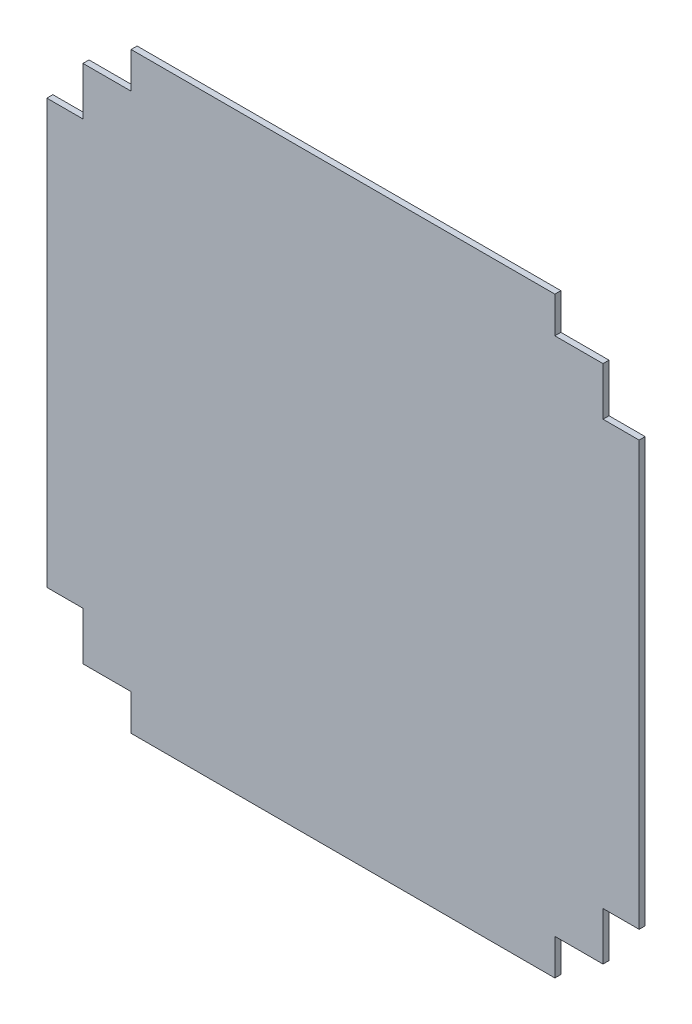
ISO-10303-21;
HEADER;
FILE_DESCRIPTION(('STEP AP214'),'2;1');
FILE_NAME('part.step','',(''),(''),'','','');
FILE_SCHEMA(('AUTOMOTIVE_DESIGN { 1 0 10303 214 1 1 1 1 }'));
ENDSEC;
DATA;
#1=APPLICATION_CONTEXT('core data for automotive mechanical design processes');
#2=APPLICATION_PROTOCOL_DEFINITION('international standard','automotive_design',2000,#1);
#3=PRODUCT_CONTEXT('',#1,'mechanical');
#4=PRODUCT('Part','Part','',(#3));
#5=PRODUCT_RELATED_PRODUCT_CATEGORY('part','',(#4));
#6=PRODUCT_DEFINITION_FORMATION('','',#4);
#7=PRODUCT_DEFINITION_CONTEXT('part definition',#1,'design');
#8=PRODUCT_DEFINITION('design','',#6,#7);
#9=PRODUCT_DEFINITION_SHAPE('','',#8);
#10=(LENGTH_UNIT() NAMED_UNIT(*) SI_UNIT(.MILLI.,.METRE.));
#11=(NAMED_UNIT(*) PLANE_ANGLE_UNIT() SI_UNIT($,.RADIAN.));
#12=(NAMED_UNIT(*) SI_UNIT($,.STERADIAN.) SOLID_ANGLE_UNIT());
#13=UNCERTAINTY_MEASURE_WITH_UNIT(LENGTH_MEASURE(1.E-05),#10,'distance_accuracy_value','');
#14=(GEOMETRIC_REPRESENTATION_CONTEXT(3) GLOBAL_UNCERTAINTY_ASSIGNED_CONTEXT((#13)) GLOBAL_UNIT_ASSIGNED_CONTEXT((#10,
#11,#12)) REPRESENTATION_CONTEXT('',''));
#15=CARTESIAN_POINT('',(0.,0.,0.));
#16=DIRECTION('',(0.,0.,1.));
#17=DIRECTION('',(1.,0.,0.));
#18=AXIS2_PLACEMENT_3D('',#15,#16,#17);
#19=CARTESIAN_POINT('',(0.,246.,5.));
#20=DIRECTION('',(0.,1.,0.));
#21=DIRECTION('',(0.,0.,1.));
#22=AXIS2_PLACEMENT_3D('',#19,#20,#21);
#23=PLANE('',#22);
#24=DIRECTION('',(1.,0.,0.));
#25=VECTOR('',#24,1.);
#26=CARTESIAN_POINT('',(0.,246.,0.));
#27=LINE('',#26,#25);
#28=CARTESIAN_POINT('',(-176.,246.,0.));
#29=VERTEX_POINT('',#28);
#30=CARTESIAN_POINT('',(176.,246.,0.));
#31=VERTEX_POINT('',#30);
#32=EDGE_CURVE('E209',#29,#31,#27,.T.);
#33=ORIENTED_EDGE('',*,*,#32,.F.);
#34=DIRECTION('',(0.,0.,-1.));
#35=VECTOR('',#34,1.);
#36=CARTESIAN_POINT('',(-176.,246.,5.));
#37=LINE('',#36,#35);
#38=CARTESIAN_POINT('',(-176.,246.,5.));
#39=VERTEX_POINT('',#38);
#40=EDGE_CURVE('E11',#39,#29,#37,.T.);
#41=ORIENTED_EDGE('',*,*,#40,.F.);
#42=DIRECTION('',(1.,0.,0.));
#43=VECTOR('',#42,1.);
#44=CARTESIAN_POINT('',(0.,246.,5.));
#45=LINE('',#44,#43);
#46=CARTESIAN_POINT('',(176.,246.,5.));
#47=VERTEX_POINT('',#46);
#48=EDGE_CURVE('E258',#39,#47,#45,.T.);
#49=ORIENTED_EDGE('',*,*,#48,.T.);
#50=DIRECTION('',(0.,0.,-1.));
#51=VECTOR('',#50,1.);
#52=CARTESIAN_POINT('',(176.,246.,5.));
#53=LINE('',#52,#51);
#54=EDGE_CURVE('E132',#47,#31,#53,.T.);
#55=ORIENTED_EDGE('',*,*,#54,.T.);
#56=EDGE_LOOP('',(#33,#41,#49,#55));
#57=FACE_BOUND('',#56,.T.);
#58=ADVANCED_FACE('F45',(#57),#23,.T.);
#59=CARTESIAN_POINT('',(-176.,0.,5.));
#60=DIRECTION('',(-1.,0.,0.));
#61=DIRECTION('',(0.,0.,1.));
#62=AXIS2_PLACEMENT_3D('',#59,#60,#61);
#63=PLANE('',#62);
#64=DIRECTION('',(0.,1.,0.));
#65=VECTOR('',#64,1.);
#66=CARTESIAN_POINT('',(-176.,0.,0.));
#67=LINE('',#66,#65);
#68=CARTESIAN_POINT('',(-176.,216.,0.));
#69=VERTEX_POINT('',#68);
#70=EDGE_CURVE('E212',#69,#29,#67,.T.);
#71=ORIENTED_EDGE('',*,*,#70,.F.);
#72=DIRECTION('',(0.,0.,-1.));
#73=VECTOR('',#72,1.);
#74=CARTESIAN_POINT('',(-176.,216.,5.));
#75=LINE('',#74,#73);
#76=CARTESIAN_POINT('',(-176.,216.,5.));
#77=VERTEX_POINT('',#76);
#78=EDGE_CURVE('E53',#77,#69,#75,.T.);
#79=ORIENTED_EDGE('',*,*,#78,.F.);
#80=DIRECTION('',(0.,1.,0.));
#81=VECTOR('',#80,1.);
#82=CARTESIAN_POINT('',(-176.,0.,5.));
#83=LINE('',#82,#81);
#84=EDGE_CURVE('E316',#77,#39,#83,.T.);
#85=ORIENTED_EDGE('',*,*,#84,.T.);
#86=ORIENTED_EDGE('',*,*,#40,.T.);
#87=EDGE_LOOP('',(#71,#79,#85,#86));
#88=FACE_BOUND('',#87,.T.);
#89=ADVANCED_FACE('F304',(#88),#63,.T.);
#90=CARTESIAN_POINT('',(0.,216.,5.));
#91=DIRECTION('',(0.,1.,0.));
#92=DIRECTION('',(0.,0.,1.));
#93=AXIS2_PLACEMENT_3D('',#90,#91,#92);
#94=PLANE('',#93);
#95=DIRECTION('',(1.,0.,0.));
#96=VECTOR('',#95,1.);
#97=CARTESIAN_POINT('',(0.,216.,0.));
#98=LINE('',#97,#96);
#99=CARTESIAN_POINT('',(-216.,216.,0.));
#100=VERTEX_POINT('',#99);
#101=EDGE_CURVE('E215',#100,#69,#98,.T.);
#102=ORIENTED_EDGE('',*,*,#101,.F.);
#103=DIRECTION('',(0.,0.,-1.));
#104=VECTOR('',#103,1.);
#105=CARTESIAN_POINT('',(-216.,216.,5.));
#106=LINE('',#105,#104);
#107=CARTESIAN_POINT('',(-216.,216.,5.));
#108=VERTEX_POINT('',#107);
#109=EDGE_CURVE('E293',#108,#100,#106,.T.);
#110=ORIENTED_EDGE('',*,*,#109,.F.);
#111=DIRECTION('',(1.,0.,0.));
#112=VECTOR('',#111,1.);
#113=CARTESIAN_POINT('',(0.,216.,5.));
#114=LINE('',#113,#112);
#115=EDGE_CURVE('E300',#108,#77,#114,.T.);
#116=ORIENTED_EDGE('',*,*,#115,.T.);
#117=ORIENTED_EDGE('',*,*,#78,.T.);
#118=EDGE_LOOP('',(#102,#110,#116,#117));
#119=FACE_BOUND('',#118,.T.);
#120=ADVANCED_FACE('F298',(#119),#94,.T.);
#121=CARTESIAN_POINT('',(-216.,0.,5.));
#122=DIRECTION('',(-1.,0.,0.));
#123=DIRECTION('',(0.,0.,1.));
#124=AXIS2_PLACEMENT_3D('',#121,#122,#123);
#125=PLANE('',#124);
#126=DIRECTION('',(0.,1.,0.));
#127=VECTOR('',#126,1.);
#128=CARTESIAN_POINT('',(-216.,0.,0.));
#129=LINE('',#128,#127);
#130=CARTESIAN_POINT('',(-216.,176.,0.));
#131=VERTEX_POINT('',#130);
#132=EDGE_CURVE('E218',#131,#100,#129,.T.);
#133=ORIENTED_EDGE('',*,*,#132,.F.);
#134=DIRECTION('',(0.,0.,-1.));
#135=VECTOR('',#134,1.);
#136=CARTESIAN_POINT('',(-216.,176.,5.));
#137=LINE('',#136,#135);
#138=CARTESIAN_POINT('',(-216.,176.,5.));
#139=VERTEX_POINT('',#138);
#140=EDGE_CURVE('E291',#139,#131,#137,.T.);
#141=ORIENTED_EDGE('',*,*,#140,.F.);
#142=DIRECTION('',(0.,1.,0.));
#143=VECTOR('',#142,1.);
#144=CARTESIAN_POINT('',(-216.,0.,5.));
#145=LINE('',#144,#143);
#146=EDGE_CURVE('E313',#139,#108,#145,.T.);
#147=ORIENTED_EDGE('',*,*,#146,.T.);
#148=ORIENTED_EDGE('',*,*,#109,.T.);
#149=EDGE_LOOP('',(#133,#141,#147,#148));
#150=FACE_BOUND('',#149,.T.);
#151=ADVANCED_FACE('F310',(#150),#125,.T.);
#152=CARTESIAN_POINT('',(0.,176.,5.));
#153=DIRECTION('',(0.,1.,0.));
#154=DIRECTION('',(0.,0.,1.));
#155=AXIS2_PLACEMENT_3D('',#152,#153,#154);
#156=PLANE('',#155);
#157=DIRECTION('',(1.,0.,0.));
#158=VECTOR('',#157,1.);
#159=CARTESIAN_POINT('',(0.,176.,0.));
#160=LINE('',#159,#158);
#161=CARTESIAN_POINT('',(-246.,176.,0.));
#162=VERTEX_POINT('',#161);
#163=EDGE_CURVE('E221',#162,#131,#160,.T.);
#164=ORIENTED_EDGE('',*,*,#163,.F.);
#165=DIRECTION('',(0.,0.,-1.));
#166=VECTOR('',#165,1.);
#167=CARTESIAN_POINT('',(-246.,176.,5.));
#168=LINE('',#167,#166);
#169=CARTESIAN_POINT('',(-246.,176.,5.));
#170=VERTEX_POINT('',#169);
#171=EDGE_CURVE('E289',#170,#162,#168,.T.);
#172=ORIENTED_EDGE('',*,*,#171,.F.);
#173=DIRECTION('',(1.,0.,0.));
#174=VECTOR('',#173,1.);
#175=CARTESIAN_POINT('',(0.,176.,5.));
#176=LINE('',#175,#174);
#177=EDGE_CURVE('E318',#170,#139,#176,.T.);
#178=ORIENTED_EDGE('',*,*,#177,.T.);
#179=ORIENTED_EDGE('',*,*,#140,.T.);
#180=EDGE_LOOP('',(#164,#172,#178,#179));
#181=FACE_BOUND('',#180,.T.);
#182=ADVANCED_FACE('F374',(#181),#156,.T.);
#183=CARTESIAN_POINT('',(-246.,0.,5.));
#184=DIRECTION('',(-1.,0.,0.));
#185=DIRECTION('',(0.,0.,1.));
#186=AXIS2_PLACEMENT_3D('',#183,#184,#185);
#187=PLANE('',#186);
#188=DIRECTION('',(0.,1.,0.));
#189=VECTOR('',#188,1.);
#190=CARTESIAN_POINT('',(-246.,0.,0.));
#191=LINE('',#190,#189);
#192=CARTESIAN_POINT('',(-246.,-176.,0.));
#193=VERTEX_POINT('',#192);
#194=EDGE_CURVE('E224',#193,#162,#191,.T.);
#195=ORIENTED_EDGE('',*,*,#194,.F.);
#196=DIRECTION('',(0.,0.,-1.));
#197=VECTOR('',#196,1.);
#198=CARTESIAN_POINT('',(-246.,-176.,5.));
#199=LINE('',#198,#197);
#200=CARTESIAN_POINT('',(-246.,-176.,5.));
#201=VERTEX_POINT('',#200);
#202=EDGE_CURVE('E287',#201,#193,#199,.T.);
#203=ORIENTED_EDGE('',*,*,#202,.F.);
#204=DIRECTION('',(0.,1.,0.));
#205=VECTOR('',#204,1.);
#206=CARTESIAN_POINT('',(-246.,0.,5.));
#207=LINE('',#206,#205);
#208=EDGE_CURVE('E324',#201,#170,#207,.T.);
#209=ORIENTED_EDGE('',*,*,#208,.T.);
#210=ORIENTED_EDGE('',*,*,#171,.T.);
#211=EDGE_LOOP('',(#195,#203,#209,#210));
#212=FACE_BOUND('',#211,.T.);
#213=ADVANCED_FACE('F377',(#212),#187,.T.);
#214=CARTESIAN_POINT('',(0.,-176.,5.));
#215=DIRECTION('',(0.,1.,0.));
#216=DIRECTION('',(0.,0.,1.));
#217=AXIS2_PLACEMENT_3D('',#214,#215,#216);
#218=PLANE('',#217);
#219=DIRECTION('',(1.,0.,0.));
#220=VECTOR('',#219,1.);
#221=CARTESIAN_POINT('',(0.,-176.,0.));
#222=LINE('',#221,#220);
#223=CARTESIAN_POINT('',(-216.,-176.,0.));
#224=VERTEX_POINT('',#223);
#225=EDGE_CURVE('E227',#193,#224,#222,.T.);
#226=ORIENTED_EDGE('',*,*,#225,.T.);
#227=DIRECTION('',(0.,0.,-1.));
#228=VECTOR('',#227,1.);
#229=CARTESIAN_POINT('',(-216.,-176.,5.));
#230=LINE('',#229,#228);
#231=CARTESIAN_POINT('',(-216.,-176.,5.));
#232=VERTEX_POINT('',#231);
#233=EDGE_CURVE('E284',#232,#224,#230,.T.);
#234=ORIENTED_EDGE('',*,*,#233,.F.);
#235=DIRECTION('',(1.,0.,0.));
#236=VECTOR('',#235,1.);
#237=CARTESIAN_POINT('',(0.,-176.,5.));
#238=LINE('',#237,#236);
#239=EDGE_CURVE('E327',#201,#232,#238,.T.);
#240=ORIENTED_EDGE('',*,*,#239,.F.);
#241=ORIENTED_EDGE('',*,*,#202,.T.);
#242=EDGE_LOOP('',(#226,#234,#240,#241));
#243=FACE_BOUND('',#242,.T.);
#244=ADVANCED_FACE('F381',(#243),#218,.F.);
#245=CARTESIAN_POINT('',(-216.,0.,5.));
#246=DIRECTION('',(1.,0.,0.));
#247=DIRECTION('',(0.,0.,-1.));
#248=AXIS2_PLACEMENT_3D('',#245,#246,#247);
#249=PLANE('',#248);
#250=DIRECTION('',(0.,-1.,0.));
#251=VECTOR('',#250,1.);
#252=CARTESIAN_POINT('',(-216.,0.,0.));
#253=LINE('',#252,#251);
#254=CARTESIAN_POINT('',(-216.,-216.,0.));
#255=VERTEX_POINT('',#254);
#256=EDGE_CURVE('E229',#224,#255,#253,.T.);
#257=ORIENTED_EDGE('',*,*,#256,.T.);
#258=DIRECTION('',(0.,0.,-1.));
#259=VECTOR('',#258,1.);
#260=CARTESIAN_POINT('',(-216.,-216.,5.));
#261=LINE('',#260,#259);
#262=CARTESIAN_POINT('',(-216.,-216.,5.));
#263=VERTEX_POINT('',#262);
#264=EDGE_CURVE('E281',#263,#255,#261,.T.);
#265=ORIENTED_EDGE('',*,*,#264,.F.);
#266=DIRECTION('',(0.,-1.,0.));
#267=VECTOR('',#266,1.);
#268=CARTESIAN_POINT('',(-216.,0.,5.));
#269=LINE('',#268,#267);
#270=EDGE_CURVE('E329',#232,#263,#269,.T.);
#271=ORIENTED_EDGE('',*,*,#270,.F.);
#272=ORIENTED_EDGE('',*,*,#233,.T.);
#273=EDGE_LOOP('',(#257,#265,#271,#272));
#274=FACE_BOUND('',#273,.T.);
#275=ADVANCED_FACE('F385',(#274),#249,.F.);
#276=CARTESIAN_POINT('',(0.,-216.,5.));
#277=DIRECTION('',(0.,1.,0.));
#278=DIRECTION('',(0.,0.,1.));
#279=AXIS2_PLACEMENT_3D('',#276,#277,#278);
#280=PLANE('',#279);
#281=DIRECTION('',(1.,0.,0.));
#282=VECTOR('',#281,1.);
#283=CARTESIAN_POINT('',(0.,-216.,0.));
#284=LINE('',#283,#282);
#285=CARTESIAN_POINT('',(-176.,-216.,0.));
#286=VERTEX_POINT('',#285);
#287=EDGE_CURVE('E231',#255,#286,#284,.T.);
#288=ORIENTED_EDGE('',*,*,#287,.T.);
#289=DIRECTION('',(0.,0.,-1.));
#290=VECTOR('',#289,1.);
#291=CARTESIAN_POINT('',(-176.,-216.,5.));
#292=LINE('',#291,#290);
#293=CARTESIAN_POINT('',(-176.,-216.,5.));
#294=VERTEX_POINT('',#293);
#295=EDGE_CURVE('E278',#294,#286,#292,.T.);
#296=ORIENTED_EDGE('',*,*,#295,.F.);
#297=DIRECTION('',(1.,0.,0.));
#298=VECTOR('',#297,1.);
#299=CARTESIAN_POINT('',(0.,-216.,5.));
#300=LINE('',#299,#298);
#301=EDGE_CURVE('E331',#263,#294,#300,.T.);
#302=ORIENTED_EDGE('',*,*,#301,.F.);
#303=ORIENTED_EDGE('',*,*,#264,.T.);
#304=EDGE_LOOP('',(#288,#296,#302,#303));
#305=FACE_BOUND('',#304,.T.);
#306=ADVANCED_FACE('F389',(#305),#280,.F.);
#307=CARTESIAN_POINT('',(-176.,0.,5.));
#308=DIRECTION('',(1.,0.,0.));
#309=DIRECTION('',(0.,0.,-1.));
#310=AXIS2_PLACEMENT_3D('',#307,#308,#309);
#311=PLANE('',#310);
#312=DIRECTION('',(0.,-1.,0.));
#313=VECTOR('',#312,1.);
#314=CARTESIAN_POINT('',(-176.,0.,0.));
#315=LINE('',#314,#313);
#316=CARTESIAN_POINT('',(-176.,-246.,0.));
#317=VERTEX_POINT('',#316);
#318=EDGE_CURVE('E233',#286,#317,#315,.T.);
#319=ORIENTED_EDGE('',*,*,#318,.T.);
#320=DIRECTION('',(0.,0.,-1.));
#321=VECTOR('',#320,1.);
#322=CARTESIAN_POINT('',(-176.,-246.,5.));
#323=LINE('',#322,#321);
#324=CARTESIAN_POINT('',(-176.,-246.,5.));
#325=VERTEX_POINT('',#324);
#326=EDGE_CURVE('E275',#325,#317,#323,.T.);
#327=ORIENTED_EDGE('',*,*,#326,.F.);
#328=DIRECTION('',(0.,-1.,0.));
#329=VECTOR('',#328,1.);
#330=CARTESIAN_POINT('',(-176.,0.,5.));
#331=LINE('',#330,#329);
#332=EDGE_CURVE('E333',#294,#325,#331,.T.);
#333=ORIENTED_EDGE('',*,*,#332,.F.);
#334=ORIENTED_EDGE('',*,*,#295,.T.);
#335=EDGE_LOOP('',(#319,#327,#333,#334));
#336=FACE_BOUND('',#335,.T.);
#337=ADVANCED_FACE('F393',(#336),#311,.F.);
#338=CARTESIAN_POINT('',(0.,-246.,5.));
#339=DIRECTION('',(0.,1.,0.));
#340=DIRECTION('',(0.,0.,1.));
#341=AXIS2_PLACEMENT_3D('',#338,#339,#340);
#342=PLANE('',#341);
#343=DIRECTION('',(1.,0.,0.));
#344=VECTOR('',#343,1.);
#345=CARTESIAN_POINT('',(0.,-246.,0.));
#346=LINE('',#345,#344);
#347=CARTESIAN_POINT('',(176.,-246.,0.));
#348=VERTEX_POINT('',#347);
#349=EDGE_CURVE('E235',#317,#348,#346,.T.);
#350=ORIENTED_EDGE('',*,*,#349,.T.);
#351=DIRECTION('',(0.,0.,-1.));
#352=VECTOR('',#351,1.);
#353=CARTESIAN_POINT('',(176.,-246.,5.));
#354=LINE('',#353,#352);
#355=CARTESIAN_POINT('',(176.,-246.,5.));
#356=VERTEX_POINT('',#355);
#357=EDGE_CURVE('E273',#356,#348,#354,.T.);
#358=ORIENTED_EDGE('',*,*,#357,.F.);
#359=DIRECTION('',(1.,0.,0.));
#360=VECTOR('',#359,1.);
#361=CARTESIAN_POINT('',(0.,-246.,5.));
#362=LINE('',#361,#360);
#363=EDGE_CURVE('E335',#325,#356,#362,.T.);
#364=ORIENTED_EDGE('',*,*,#363,.F.);
#365=ORIENTED_EDGE('',*,*,#326,.T.);
#366=EDGE_LOOP('',(#350,#358,#364,#365));
#367=FACE_BOUND('',#366,.T.);
#368=ADVANCED_FACE('F397',(#367),#342,.F.);
#369=CARTESIAN_POINT('',(176.,0.,5.));
#370=DIRECTION('',(1.,0.,0.));
#371=DIRECTION('',(0.,0.,-1.));
#372=AXIS2_PLACEMENT_3D('',#369,#370,#371);
#373=PLANE('',#372);
#374=DIRECTION('',(0.,-1.,0.));
#375=VECTOR('',#374,1.);
#376=CARTESIAN_POINT('',(176.,0.,0.));
#377=LINE('',#376,#375);
#378=CARTESIAN_POINT('',(176.,-216.,0.));
#379=VERTEX_POINT('',#378);
#380=EDGE_CURVE('E238',#379,#348,#377,.T.);
#381=ORIENTED_EDGE('',*,*,#380,.F.);
#382=DIRECTION('',(0.,0.,-1.));
#383=VECTOR('',#382,1.);
#384=CARTESIAN_POINT('',(176.,-216.,5.));
#385=LINE('',#384,#383);
#386=CARTESIAN_POINT('',(176.,-216.,5.));
#387=VERTEX_POINT('',#386);
#388=EDGE_CURVE('E271',#387,#379,#385,.T.);
#389=ORIENTED_EDGE('',*,*,#388,.F.);
#390=DIRECTION('',(0.,-1.,0.));
#391=VECTOR('',#390,1.);
#392=CARTESIAN_POINT('',(176.,0.,5.));
#393=LINE('',#392,#391);
#394=EDGE_CURVE('E337',#387,#356,#393,.T.);
#395=ORIENTED_EDGE('',*,*,#394,.T.);
#396=ORIENTED_EDGE('',*,*,#357,.T.);
#397=EDGE_LOOP('',(#381,#389,#395,#396));
#398=FACE_BOUND('',#397,.T.);
#399=ADVANCED_FACE('F401',(#398),#373,.T.);
#400=CARTESIAN_POINT('',(0.,-216.,5.));
#401=DIRECTION('',(0.,-1.,0.));
#402=DIRECTION('',(0.,0.,-1.));
#403=AXIS2_PLACEMENT_3D('',#400,#401,#402);
#404=PLANE('',#403);
#405=DIRECTION('',(-1.,0.,0.));
#406=VECTOR('',#405,1.);
#407=CARTESIAN_POINT('',(0.,-216.,0.));
#408=LINE('',#407,#406);
#409=CARTESIAN_POINT('',(216.,-216.,0.));
#410=VERTEX_POINT('',#409);
#411=EDGE_CURVE('E241',#410,#379,#408,.T.);
#412=ORIENTED_EDGE('',*,*,#411,.F.);
#413=DIRECTION('',(0.,0.,-1.));
#414=VECTOR('',#413,1.);
#415=CARTESIAN_POINT('',(216.,-216.,5.));
#416=LINE('',#415,#414);
#417=CARTESIAN_POINT('',(216.,-216.,5.));
#418=VERTEX_POINT('',#417);
#419=EDGE_CURVE('E269',#418,#410,#416,.T.);
#420=ORIENTED_EDGE('',*,*,#419,.F.);
#421=DIRECTION('',(-1.,0.,0.));
#422=VECTOR('',#421,1.);
#423=CARTESIAN_POINT('',(0.,-216.,5.));
#424=LINE('',#423,#422);
#425=EDGE_CURVE('E340',#418,#387,#424,.T.);
#426=ORIENTED_EDGE('',*,*,#425,.T.);
#427=ORIENTED_EDGE('',*,*,#388,.T.);
#428=EDGE_LOOP('',(#412,#420,#426,#427));
#429=FACE_BOUND('',#428,.T.);
#430=ADVANCED_FACE('F405',(#429),#404,.T.);
#431=CARTESIAN_POINT('',(216.,0.,5.));
#432=DIRECTION('',(1.,0.,0.));
#433=DIRECTION('',(0.,0.,-1.));
#434=AXIS2_PLACEMENT_3D('',#431,#432,#433);
#435=PLANE('',#434);
#436=DIRECTION('',(0.,-1.,0.));
#437=VECTOR('',#436,1.);
#438=CARTESIAN_POINT('',(216.,0.,0.));
#439=LINE('',#438,#437);
#440=CARTESIAN_POINT('',(216.,-176.,0.));
#441=VERTEX_POINT('',#440);
#442=EDGE_CURVE('E244',#441,#410,#439,.T.);
#443=ORIENTED_EDGE('',*,*,#442,.F.);
#444=DIRECTION('',(0.,0.,-1.));
#445=VECTOR('',#444,1.);
#446=CARTESIAN_POINT('',(216.,-176.,5.));
#447=LINE('',#446,#445);
#448=CARTESIAN_POINT('',(216.,-176.,5.));
#449=VERTEX_POINT('',#448);
#450=EDGE_CURVE('E267',#449,#441,#447,.T.);
#451=ORIENTED_EDGE('',*,*,#450,.F.);
#452=DIRECTION('',(0.,-1.,0.));
#453=VECTOR('',#452,1.);
#454=CARTESIAN_POINT('',(216.,0.,5.));
#455=LINE('',#454,#453);
#456=EDGE_CURVE('E343',#449,#418,#455,.T.);
#457=ORIENTED_EDGE('',*,*,#456,.T.);
#458=ORIENTED_EDGE('',*,*,#419,.T.);
#459=EDGE_LOOP('',(#443,#451,#457,#458));
#460=FACE_BOUND('',#459,.T.);
#461=ADVANCED_FACE('F409',(#460),#435,.T.);
#462=CARTESIAN_POINT('',(0.,-176.,5.));
#463=DIRECTION('',(0.,-1.,0.));
#464=DIRECTION('',(0.,0.,-1.));
#465=AXIS2_PLACEMENT_3D('',#462,#463,#464);
#466=PLANE('',#465);
#467=DIRECTION('',(-1.,0.,0.));
#468=VECTOR('',#467,1.);
#469=CARTESIAN_POINT('',(0.,-176.,0.));
#470=LINE('',#469,#468);
#471=CARTESIAN_POINT('',(246.,-176.,0.));
#472=VERTEX_POINT('',#471);
#473=EDGE_CURVE('E247',#472,#441,#470,.T.);
#474=ORIENTED_EDGE('',*,*,#473,.F.);
#475=DIRECTION('',(0.,0.,-1.));
#476=VECTOR('',#475,1.);
#477=CARTESIAN_POINT('',(246.,-176.,5.));
#478=LINE('',#477,#476);
#479=CARTESIAN_POINT('',(246.,-176.,5.));
#480=VERTEX_POINT('',#479);
#481=EDGE_CURVE('E265',#480,#472,#478,.T.);
#482=ORIENTED_EDGE('',*,*,#481,.F.);
#483=DIRECTION('',(-1.,0.,0.));
#484=VECTOR('',#483,1.);
#485=CARTESIAN_POINT('',(0.,-176.,5.));
#486=LINE('',#485,#484);
#487=EDGE_CURVE('E346',#480,#449,#486,.T.);
#488=ORIENTED_EDGE('',*,*,#487,.T.);
#489=ORIENTED_EDGE('',*,*,#450,.T.);
#490=EDGE_LOOP('',(#474,#482,#488,#489));
#491=FACE_BOUND('',#490,.T.);
#492=ADVANCED_FACE('F413',(#491),#466,.T.);
#493=CARTESIAN_POINT('',(246.,0.,5.));
#494=DIRECTION('',(-1.,0.,0.));
#495=DIRECTION('',(0.,0.,1.));
#496=AXIS2_PLACEMENT_3D('',#493,#494,#495);
#497=PLANE('',#496);
#498=DIRECTION('',(0.,1.,0.));
#499=VECTOR('',#498,1.);
#500=CARTESIAN_POINT('',(246.,0.,0.));
#501=LINE('',#500,#499);
#502=CARTESIAN_POINT('',(246.,176.,0.));
#503=VERTEX_POINT('',#502);
#504=EDGE_CURVE('E250',#472,#503,#501,.T.);
#505=ORIENTED_EDGE('',*,*,#504,.T.);
#506=DIRECTION('',(0.,0.,-1.));
#507=VECTOR('',#506,1.);
#508=CARTESIAN_POINT('',(246.,176.,5.));
#509=LINE('',#508,#507);
#510=CARTESIAN_POINT('',(246.,176.,5.));
#511=VERTEX_POINT('',#510);
#512=EDGE_CURVE('E262',#511,#503,#509,.T.);
#513=ORIENTED_EDGE('',*,*,#512,.F.);
#514=DIRECTION('',(0.,1.,0.));
#515=VECTOR('',#514,1.);
#516=CARTESIAN_POINT('',(246.,0.,5.));
#517=LINE('',#516,#515);
#518=EDGE_CURVE('E349',#480,#511,#517,.T.);
#519=ORIENTED_EDGE('',*,*,#518,.F.);
#520=ORIENTED_EDGE('',*,*,#481,.T.);
#521=EDGE_LOOP('',(#505,#513,#519,#520));
#522=FACE_BOUND('',#521,.T.);
#523=ADVANCED_FACE('F355',(#522),#497,.F.);
#524=CARTESIAN_POINT('',(0.,176.,5.));
#525=DIRECTION('',(0.,-1.,0.));
#526=DIRECTION('',(0.,0.,-1.));
#527=AXIS2_PLACEMENT_3D('',#524,#525,#526);
#528=PLANE('',#527);
#529=DIRECTION('',(-1.,0.,0.));
#530=VECTOR('',#529,1.);
#531=CARTESIAN_POINT('',(0.,176.,0.));
#532=LINE('',#531,#530);
#533=CARTESIAN_POINT('',(216.,176.,0.));
#534=VERTEX_POINT('',#533);
#535=EDGE_CURVE('E252',#503,#534,#532,.T.);
#536=ORIENTED_EDGE('',*,*,#535,.T.);
#537=DIRECTION('',(0.,0.,-1.));
#538=VECTOR('',#537,1.);
#539=CARTESIAN_POINT('',(216.,176.,5.));
#540=LINE('',#539,#538);
#541=CARTESIAN_POINT('',(216.,176.,5.));
#542=VERTEX_POINT('',#541);
#543=EDGE_CURVE('E201',#542,#534,#540,.T.);
#544=ORIENTED_EDGE('',*,*,#543,.F.);
#545=DIRECTION('',(-1.,0.,0.));
#546=VECTOR('',#545,1.);
#547=CARTESIAN_POINT('',(0.,176.,5.));
#548=LINE('',#547,#546);
#549=EDGE_CURVE('E192',#511,#542,#548,.T.);
#550=ORIENTED_EDGE('',*,*,#549,.F.);
#551=ORIENTED_EDGE('',*,*,#512,.T.);
#552=EDGE_LOOP('',(#536,#544,#550,#551));
#553=FACE_BOUND('',#552,.T.);
#554=ADVANCED_FACE('F359',(#553),#528,.F.);
#555=CARTESIAN_POINT('',(216.,0.,5.));
#556=DIRECTION('',(-1.,0.,0.));
#557=DIRECTION('',(0.,0.,1.));
#558=AXIS2_PLACEMENT_3D('',#555,#556,#557);
#559=PLANE('',#558);
#560=DIRECTION('',(0.,1.,0.));
#561=VECTOR('',#560,1.);
#562=CARTESIAN_POINT('',(216.,0.,0.));
#563=LINE('',#562,#561);
#564=CARTESIAN_POINT('',(216.,216.,0.));
#565=VERTEX_POINT('',#564);
#566=EDGE_CURVE('E200',#534,#565,#563,.T.);
#567=ORIENTED_EDGE('',*,*,#566,.T.);
#568=DIRECTION('',(0.,0.,-1.));
#569=VECTOR('',#568,1.);
#570=CARTESIAN_POINT('',(216.,216.,5.));
#571=LINE('',#570,#569);
#572=CARTESIAN_POINT('',(216.,216.,5.));
#573=VERTEX_POINT('',#572);
#574=EDGE_CURVE('E197',#573,#565,#571,.T.);
#575=ORIENTED_EDGE('',*,*,#574,.F.);
#576=DIRECTION('',(0.,1.,0.));
#577=VECTOR('',#576,1.);
#578=CARTESIAN_POINT('',(216.,0.,5.));
#579=LINE('',#578,#577);
#580=EDGE_CURVE('E186',#542,#573,#579,.T.);
#581=ORIENTED_EDGE('',*,*,#580,.F.);
#582=ORIENTED_EDGE('',*,*,#543,.T.);
#583=EDGE_LOOP('',(#567,#575,#581,#582));
#584=FACE_BOUND('',#583,.T.);
#585=ADVANCED_FACE('F198',(#584),#559,.F.);
#586=CARTESIAN_POINT('',(0.,216.,5.));
#587=DIRECTION('',(0.,-1.,0.));
#588=DIRECTION('',(0.,0.,-1.));
#589=AXIS2_PLACEMENT_3D('',#586,#587,#588);
#590=PLANE('',#589);
#591=DIRECTION('',(-1.,0.,0.));
#592=VECTOR('',#591,1.);
#593=CARTESIAN_POINT('',(0.,216.,0.));
#594=LINE('',#593,#592);
#595=CARTESIAN_POINT('',(176.,216.,0.));
#596=VERTEX_POINT('',#595);
#597=EDGE_CURVE('E125',#565,#596,#594,.T.);
#598=ORIENTED_EDGE('',*,*,#597,.T.);
#599=DIRECTION('',(0.,0.,-1.));
#600=VECTOR('',#599,1.);
#601=CARTESIAN_POINT('',(176.,216.,5.));
#602=LINE('',#601,#600);
#603=CARTESIAN_POINT('',(176.,216.,5.));
#604=VERTEX_POINT('',#603);
#605=EDGE_CURVE('E202',#604,#596,#602,.T.);
#606=ORIENTED_EDGE('',*,*,#605,.F.);
#607=DIRECTION('',(-1.,0.,0.));
#608=VECTOR('',#607,1.);
#609=CARTESIAN_POINT('',(0.,216.,5.));
#610=LINE('',#609,#608);
#611=EDGE_CURVE('E190',#573,#604,#610,.T.);
#612=ORIENTED_EDGE('',*,*,#611,.F.);
#613=ORIENTED_EDGE('',*,*,#574,.T.);
#614=EDGE_LOOP('',(#598,#606,#612,#613));
#615=FACE_BOUND('',#614,.T.);
#616=ADVANCED_FACE('F204',(#615),#590,.F.);
#617=CARTESIAN_POINT('',(176.,0.,5.));
#618=DIRECTION('',(-1.,0.,0.));
#619=DIRECTION('',(0.,0.,1.));
#620=AXIS2_PLACEMENT_3D('',#617,#618,#619);
#621=PLANE('',#620);
#622=DIRECTION('',(0.,1.,0.));
#623=VECTOR('',#622,1.);
#624=CARTESIAN_POINT('',(176.,0.,0.));
#625=LINE('',#624,#623);
#626=EDGE_CURVE('E256',#596,#31,#625,.T.);
#627=ORIENTED_EDGE('',*,*,#626,.T.);
#628=ORIENTED_EDGE('',*,*,#54,.F.);
#629=DIRECTION('',(0.,1.,0.));
#630=VECTOR('',#629,1.);
#631=CARTESIAN_POINT('',(176.,0.,5.));
#632=LINE('',#631,#630);
#633=EDGE_CURVE('E61',#604,#47,#632,.T.);
#634=ORIENTED_EDGE('',*,*,#633,.F.);
#635=ORIENTED_EDGE('',*,*,#605,.T.);
#636=EDGE_LOOP('',(#627,#628,#634,#635));
#637=FACE_BOUND('',#636,.T.);
#638=ADVANCED_FACE('F362',(#637),#621,.F.);
#639=CARTESIAN_POINT('',(0.,0.,5.));
#640=DIRECTION('',(0.,0.,1.));
#641=DIRECTION('',(1.,0.,0.));
#642=AXIS2_PLACEMENT_3D('',#639,#640,#641);
#643=PLANE('',#642);
#644=ORIENTED_EDGE('',*,*,#48,.F.);
#645=ORIENTED_EDGE('',*,*,#84,.F.);
#646=ORIENTED_EDGE('',*,*,#115,.F.);
#647=ORIENTED_EDGE('',*,*,#146,.F.);
#648=ORIENTED_EDGE('',*,*,#177,.F.);
#649=ORIENTED_EDGE('',*,*,#208,.F.);
#650=ORIENTED_EDGE('',*,*,#239,.T.);
#651=ORIENTED_EDGE('',*,*,#270,.T.);
#652=ORIENTED_EDGE('',*,*,#301,.T.);
#653=ORIENTED_EDGE('',*,*,#332,.T.);
#654=ORIENTED_EDGE('',*,*,#363,.T.);
#655=ORIENTED_EDGE('',*,*,#394,.F.);
#656=ORIENTED_EDGE('',*,*,#425,.F.);
#657=ORIENTED_EDGE('',*,*,#456,.F.);
#658=ORIENTED_EDGE('',*,*,#487,.F.);
#659=ORIENTED_EDGE('',*,*,#518,.T.);
#660=ORIENTED_EDGE('',*,*,#549,.T.);
#661=ORIENTED_EDGE('',*,*,#580,.T.);
#662=ORIENTED_EDGE('',*,*,#611,.T.);
#663=ORIENTED_EDGE('',*,*,#633,.T.);
#664=EDGE_LOOP('',(#644,#645,#646,#647,#648,#649,#650,#651,#652,#653,#654,#655,#656,#657,#658,
#659,#660,#661,#662,#663));
#665=FACE_BOUND('',#664,.T.);
#666=ADVANCED_FACE('F188',(#665),#643,.T.);
#667=CARTESIAN_POINT('',(0.,0.,0.));
#668=DIRECTION('',(0.,0.,1.));
#669=DIRECTION('',(1.,0.,0.));
#670=AXIS2_PLACEMENT_3D('',#667,#668,#669);
#671=PLANE('',#670);
#672=ORIENTED_EDGE('',*,*,#32,.T.);
#673=ORIENTED_EDGE('',*,*,#626,.F.);
#674=ORIENTED_EDGE('',*,*,#597,.F.);
#675=ORIENTED_EDGE('',*,*,#566,.F.);
#676=ORIENTED_EDGE('',*,*,#535,.F.);
#677=ORIENTED_EDGE('',*,*,#504,.F.);
#678=ORIENTED_EDGE('',*,*,#473,.T.);
#679=ORIENTED_EDGE('',*,*,#442,.T.);
#680=ORIENTED_EDGE('',*,*,#411,.T.);
#681=ORIENTED_EDGE('',*,*,#380,.T.);
#682=ORIENTED_EDGE('',*,*,#349,.F.);
#683=ORIENTED_EDGE('',*,*,#318,.F.);
#684=ORIENTED_EDGE('',*,*,#287,.F.);
#685=ORIENTED_EDGE('',*,*,#256,.F.);
#686=ORIENTED_EDGE('',*,*,#225,.F.);
#687=ORIENTED_EDGE('',*,*,#194,.T.);
#688=ORIENTED_EDGE('',*,*,#163,.T.);
#689=ORIENTED_EDGE('',*,*,#132,.T.);
#690=ORIENTED_EDGE('',*,*,#101,.T.);
#691=ORIENTED_EDGE('',*,*,#70,.T.);
#692=EDGE_LOOP('',(#672,#673,#674,#675,#676,#677,#678,#679,#680,#681,#682,#683,#684,#685,#686,
#687,#688,#689,#690,#691));
#693=FACE_BOUND('',#692,.T.);
#694=ADVANCED_FACE('F306',(#693),#671,.F.);
#695=CLOSED_SHELL('',(#58,#89,#120,#151,#182,#213,#244,#275,#306,#337,#368,#399,#430,#461,#492,
#523,#554,#585,#616,#638,#666,#694));
#696=MANIFOLD_SOLID_BREP('B2',#695);
#697=ADVANCED_BREP_SHAPE_REPRESENTATION('',(#18,#696),#14);
#698=SHAPE_DEFINITION_REPRESENTATION(#9,#697);
ENDSEC;
END-ISO-10303-21;
